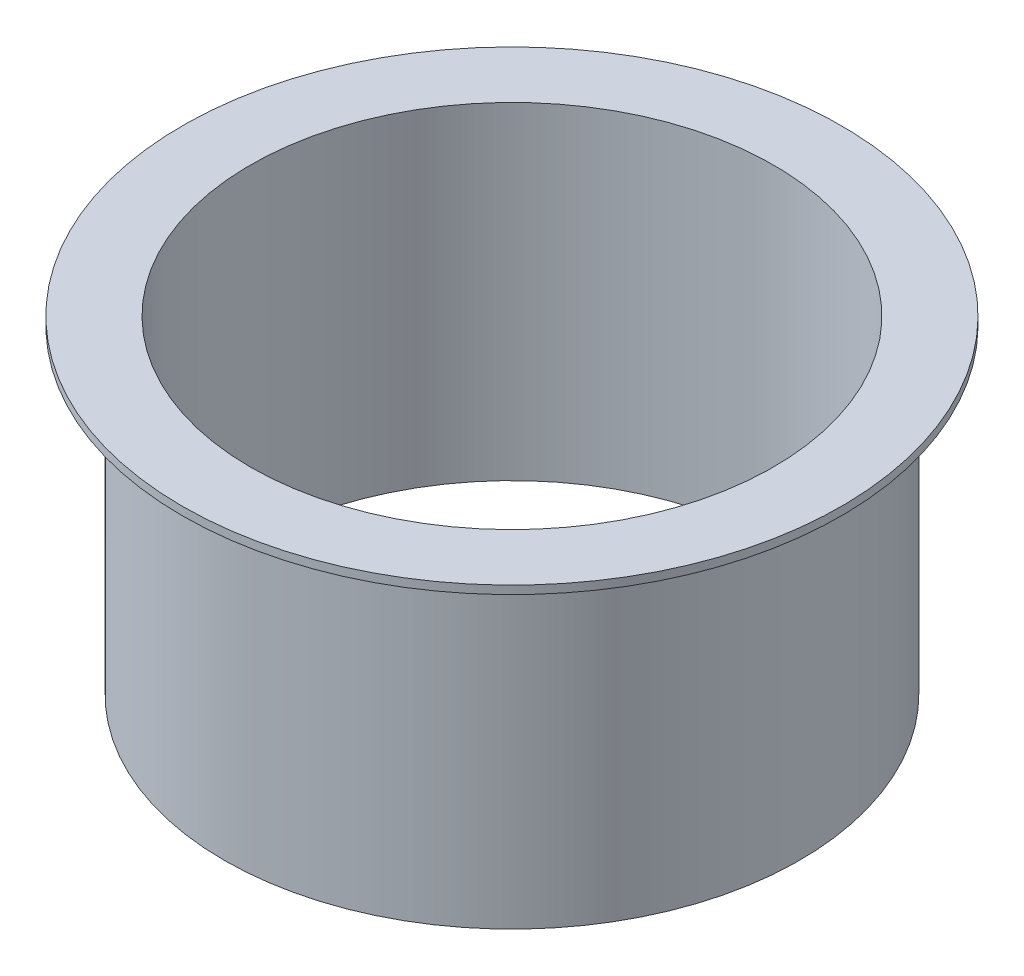
ISO-10303-21;
HEADER;
FILE_DESCRIPTION(('STEP AP214'),'2;1');
FILE_NAME('part.step','',(''),(''),'','','');
FILE_SCHEMA(('AUTOMOTIVE_DESIGN { 1 0 10303 214 1 1 1 1 }'));
ENDSEC;
DATA;
#1=APPLICATION_CONTEXT('core data for automotive mechanical design processes');
#2=APPLICATION_PROTOCOL_DEFINITION('international standard','automotive_design',2000,#1);
#3=PRODUCT_CONTEXT('',#1,'mechanical');
#4=PRODUCT('Part','Part','',(#3));
#5=PRODUCT_RELATED_PRODUCT_CATEGORY('part','',(#4));
#6=PRODUCT_DEFINITION_FORMATION('','',#4);
#7=PRODUCT_DEFINITION_CONTEXT('part definition',#1,'design');
#8=PRODUCT_DEFINITION('design','',#6,#7);
#9=PRODUCT_DEFINITION_SHAPE('','',#8);
#10=(LENGTH_UNIT() NAMED_UNIT(*) SI_UNIT(.MILLI.,.METRE.));
#11=(NAMED_UNIT(*) PLANE_ANGLE_UNIT() SI_UNIT($,.RADIAN.));
#12=(NAMED_UNIT(*) SI_UNIT($,.STERADIAN.) SOLID_ANGLE_UNIT());
#13=UNCERTAINTY_MEASURE_WITH_UNIT(LENGTH_MEASURE(1.E-05),#10,'distance_accuracy_value','');
#14=(GEOMETRIC_REPRESENTATION_CONTEXT(3) GLOBAL_UNCERTAINTY_ASSIGNED_CONTEXT((#13)) GLOBAL_UNIT_ASSIGNED_CONTEXT((#10,
#11,#12)) REPRESENTATION_CONTEXT('',''));
#15=CARTESIAN_POINT('',(0.,0.,0.));
#16=DIRECTION('',(0.,0.,1.));
#17=DIRECTION('',(1.,0.,0.));
#18=AXIS2_PLACEMENT_3D('',#15,#16,#17);
#19=CARTESIAN_POINT('',(0.,1.59,0.));
#20=DIRECTION('',(0.,1.,0.));
#21=DIRECTION('',(0.,0.,1.));
#22=AXIS2_PLACEMENT_3D('',#19,#20,#21);
#23=PLANE('',#22);
#24=CARTESIAN_POINT('',(0.,1.59,0.));
#25=DIRECTION('',(0.,1.,0.));
#26=DIRECTION('',(0.,0.,1.));
#27=AXIS2_PLACEMENT_3D('',#24,#25,#26);
#28=CIRCLE('',#27,1.27);
#29=CARTESIAN_POINT('',(0.,1.59,1.27));
#30=VERTEX_POINT('',#29);
#31=EDGE_CURVE('E18',#30,#30,#28,.F.);
#32=ORIENTED_EDGE('',*,*,#31,.T.);
#33=EDGE_LOOP('',(#32));
#34=FACE_BOUND('',#33,.T.);
#35=CARTESIAN_POINT('',(0.,1.59,0.));
#36=DIRECTION('',(0.,1.,0.));
#37=DIRECTION('',(0.,0.,1.));
#38=AXIS2_PLACEMENT_3D('',#35,#36,#37);
#39=CIRCLE('',#38,1.6);
#40=CARTESIAN_POINT('',(0.,1.59,1.6));
#41=VERTEX_POINT('',#40);
#42=EDGE_CURVE('E34',#41,#41,#39,.F.);
#43=ORIENTED_EDGE('',*,*,#42,.F.);
#44=EDGE_LOOP('',(#43));
#45=FACE_BOUND('',#44,.T.);
#46=ADVANCED_FACE('F15',(#34,#45),#23,.T.);
#47=CARTESIAN_POINT('',(0.,0.,0.));
#48=DIRECTION('',(0.,1.,0.));
#49=DIRECTION('',(0.,0.,1.));
#50=AXIS2_PLACEMENT_3D('',#47,#48,#49);
#51=CYLINDRICAL_SURFACE('',#50,1.27);
#52=ORIENTED_EDGE('',*,*,#31,.F.);
#53=EDGE_LOOP('',(#52));
#54=FACE_BOUND('',#53,.T.);
#55=CARTESIAN_POINT('',(0.,0.,0.));
#56=DIRECTION('',(0.,1.,0.));
#57=DIRECTION('',(0.,0.,1.));
#58=AXIS2_PLACEMENT_3D('',#55,#56,#57);
#59=CIRCLE('',#58,1.27);
#60=CARTESIAN_POINT('',(0.,0.,1.27));
#61=VERTEX_POINT('',#60);
#62=EDGE_CURVE('E32',#61,#61,#59,.F.);
#63=ORIENTED_EDGE('',*,*,#62,.T.);
#64=EDGE_LOOP('',(#63));
#65=FACE_BOUND('',#64,.T.);
#66=ADVANCED_FACE('F43',(#54,#65),#51,.F.);
#67=CARTESIAN_POINT('',(0.,0.,0.));
#68=DIRECTION('',(0.,1.,0.));
#69=DIRECTION('',(0.,0.,1.));
#70=AXIS2_PLACEMENT_3D('',#67,#68,#69);
#71=CYLINDRICAL_SURFACE('',#70,1.6);
#72=CARTESIAN_POINT('',(0.,1.55,0.));
#73=DIRECTION('',(0.,1.,0.));
#74=DIRECTION('',(0.,0.,1.));
#75=AXIS2_PLACEMENT_3D('',#72,#73,#74);
#76=CIRCLE('',#75,1.6);
#77=CARTESIAN_POINT('',(0.,1.55,1.6));
#78=VERTEX_POINT('',#77);
#79=EDGE_CURVE('E27',#78,#78,#76,.F.);
#80=ORIENTED_EDGE('',*,*,#79,.F.);
#81=EDGE_LOOP('',(#80));
#82=FACE_BOUND('',#81,.T.);
#83=ORIENTED_EDGE('',*,*,#42,.T.);
#84=EDGE_LOOP('',(#83));
#85=FACE_BOUND('',#84,.T.);
#86=ADVANCED_FACE('F46',(#82,#85),#71,.T.);
#87=CARTESIAN_POINT('',(0.,0.,0.));
#88=DIRECTION('',(0.,1.,0.));
#89=DIRECTION('',(0.,0.,1.));
#90=AXIS2_PLACEMENT_3D('',#87,#88,#89);
#91=PLANE('',#90);
#92=ORIENTED_EDGE('',*,*,#62,.F.);
#93=EDGE_LOOP('',(#92));
#94=FACE_BOUND('',#93,.T.);
#95=CARTESIAN_POINT('',(0.,0.,0.));
#96=DIRECTION('',(0.,1.,0.));
#97=DIRECTION('',(0.,0.,1.));
#98=AXIS2_PLACEMENT_3D('',#95,#96,#97);
#99=CIRCLE('',#98,1.397);
#100=CARTESIAN_POINT('',(0.,0.,1.397));
#101=VERTEX_POINT('',#100);
#102=EDGE_CURVE('E22',#101,#101,#99,.T.);
#103=ORIENTED_EDGE('',*,*,#102,.F.);
#104=EDGE_LOOP('',(#103));
#105=FACE_BOUND('',#104,.T.);
#106=ADVANCED_FACE('F49',(#94,#105),#91,.F.);
#107=CARTESIAN_POINT('',(0.,1.55,0.));
#108=DIRECTION('',(0.,-1.,0.));
#109=DIRECTION('',(0.,0.,-1.));
#110=AXIS2_PLACEMENT_3D('',#107,#108,#109);
#111=PLANE('',#110);
#112=CARTESIAN_POINT('',(0.,1.55,0.));
#113=DIRECTION('',(0.,1.,0.));
#114=DIRECTION('',(0.,0.,1.));
#115=AXIS2_PLACEMENT_3D('',#112,#113,#114);
#116=CIRCLE('',#115,1.397);
#117=CARTESIAN_POINT('',(0.,1.55,1.397));
#118=VERTEX_POINT('',#117);
#119=EDGE_CURVE('E10',#118,#118,#116,.F.);
#120=ORIENTED_EDGE('',*,*,#119,.F.);
#121=EDGE_LOOP('',(#120));
#122=FACE_BOUND('',#121,.T.);
#123=ORIENTED_EDGE('',*,*,#79,.T.);
#124=EDGE_LOOP('',(#123));
#125=FACE_BOUND('',#124,.T.);
#126=ADVANCED_FACE('F52',(#122,#125),#111,.T.);
#127=CARTESIAN_POINT('',(0.,0.,0.));
#128=DIRECTION('',(0.,1.,0.));
#129=DIRECTION('',(0.,0.,1.));
#130=AXIS2_PLACEMENT_3D('',#127,#128,#129);
#131=CYLINDRICAL_SURFACE('',#130,1.397);
#132=ORIENTED_EDGE('',*,*,#119,.T.);
#133=EDGE_LOOP('',(#132));
#134=FACE_BOUND('',#133,.T.);
#135=ORIENTED_EDGE('',*,*,#102,.T.);
#136=EDGE_LOOP('',(#135));
#137=FACE_BOUND('',#136,.T.);
#138=ADVANCED_FACE('F56',(#134,#137),#131,.T.);
#139=CLOSED_SHELL('',(#46,#66,#86,#106,#126,#138));
#140=MANIFOLD_SOLID_BREP('B1',#139);
#141=ADVANCED_BREP_SHAPE_REPRESENTATION('',(#18,#140),#14);
#142=SHAPE_DEFINITION_REPRESENTATION(#9,#141);
ENDSEC;
END-ISO-10303-21;
